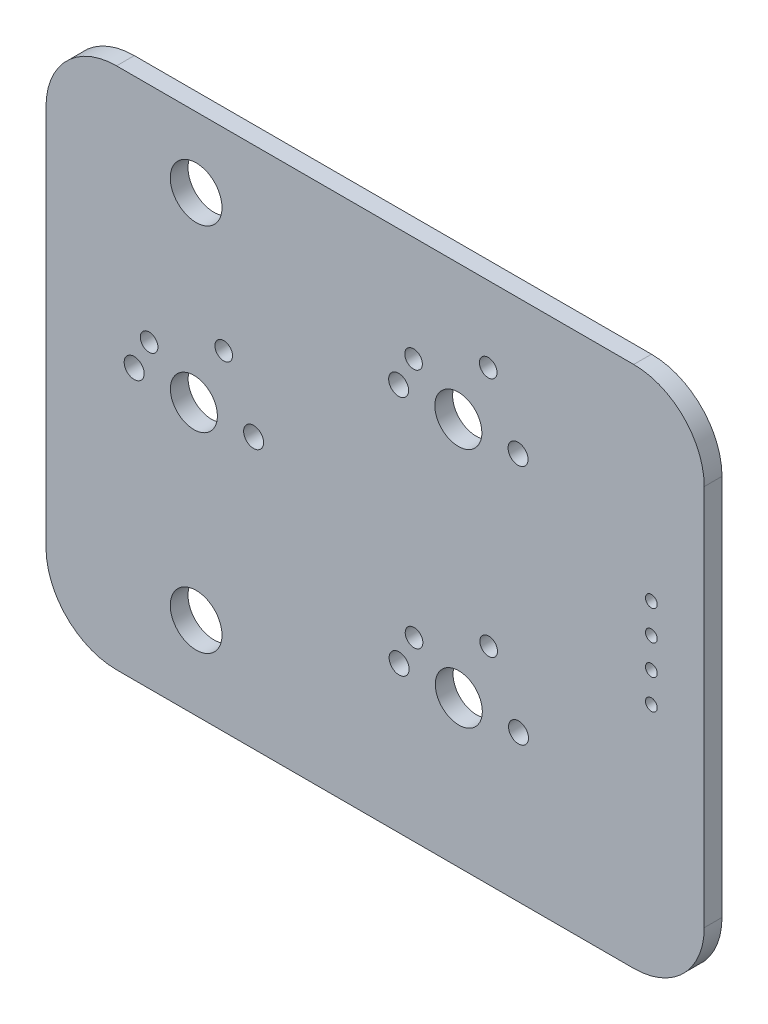
ISO-10303-21;
HEADER;
FILE_DESCRIPTION(('STEP AP214'),'2;1');
FILE_NAME('part.step','',(''),(''),'','','');
FILE_SCHEMA(('AUTOMOTIVE_DESIGN { 1 0 10303 214 1 1 1 1 }'));
ENDSEC;
DATA;
#1=APPLICATION_CONTEXT('core data for automotive mechanical design processes');
#2=APPLICATION_PROTOCOL_DEFINITION('international standard','automotive_design',2000,#1);
#3=PRODUCT_CONTEXT('',#1,'mechanical');
#4=PRODUCT('Part','Part','',(#3));
#5=PRODUCT_RELATED_PRODUCT_CATEGORY('part','',(#4));
#6=PRODUCT_DEFINITION_FORMATION('','',#4);
#7=PRODUCT_DEFINITION_CONTEXT('part definition',#1,'design');
#8=PRODUCT_DEFINITION('design','',#6,#7);
#9=PRODUCT_DEFINITION_SHAPE('','',#8);
#10=(LENGTH_UNIT() NAMED_UNIT(*) SI_UNIT(.MILLI.,.METRE.));
#11=(NAMED_UNIT(*) PLANE_ANGLE_UNIT() SI_UNIT($,.RADIAN.));
#12=(NAMED_UNIT(*) SI_UNIT($,.STERADIAN.) SOLID_ANGLE_UNIT());
#13=UNCERTAINTY_MEASURE_WITH_UNIT(LENGTH_MEASURE(1.E-05),#10,'distance_accuracy_value','');
#14=(GEOMETRIC_REPRESENTATION_CONTEXT(3) GLOBAL_UNCERTAINTY_ASSIGNED_CONTEXT((#13)) GLOBAL_UNIT_ASSIGNED_CONTEXT((#10,
#11,#12)) REPRESENTATION_CONTEXT('',''));
#15=CARTESIAN_POINT('',(0.,0.,0.));
#16=DIRECTION('',(0.,0.,1.));
#17=DIRECTION('',(1.,0.,0.));
#18=AXIS2_PLACEMENT_3D('',#15,#16,#17);
#19=CARTESIAN_POINT('',(76.35,-76.46,-0.046));
#20=DIRECTION('',(0.,0.,-1.));
#21=DIRECTION('',(0.,-1.,0.));
#22=AXIS2_PLACEMENT_3D('',#19,#20,#21);
#23=CYLINDRICAL_SURFACE('',#22,0.75);
#24=CARTESIAN_POINT('',(76.35,-76.46,0.));
#25=DIRECTION('',(0.,0.,-1.));
#26=DIRECTION('',(0.,-1.,0.));
#27=AXIS2_PLACEMENT_3D('',#24,#25,#26);
#28=CIRCLE('',#27,0.75);
#29=CARTESIAN_POINT('',(76.35,-77.21,0.));
#30=VERTEX_POINT('',#29);
#31=EDGE_CURVE('E474',#30,#30,#28,.T.);
#32=ORIENTED_EDGE('',*,*,#31,.T.);
#33=DIRECTION('',(0.,0.,1.));
#34=VECTOR('',#33,1.);
#35=CARTESIAN_POINT('',(76.35,-77.21,-0.046));
#36=LINE('',#35,#34);
#37=CARTESIAN_POINT('',(76.35,-77.21,1.51));
#38=VERTEX_POINT('',#37);
#39=EDGE_CURVE('E11',#30,#38,#36,.T.);
#40=ORIENTED_EDGE('',*,*,#39,.T.);
#41=CARTESIAN_POINT('',(76.35,-76.46,1.51));
#42=DIRECTION('',(0.,0.,-1.));
#43=DIRECTION('',(0.,-1.,0.));
#44=AXIS2_PLACEMENT_3D('',#41,#42,#43);
#45=CIRCLE('',#44,0.75);
#46=EDGE_CURVE('E547',#38,#38,#45,.T.);
#47=ORIENTED_EDGE('',*,*,#46,.F.);
#48=ORIENTED_EDGE('',*,*,#39,.F.);
#49=EDGE_LOOP('',(#32,#40,#47,#48));
#50=FACE_BOUND('',#49,.T.);
#51=ADVANCED_FACE('F17',(#50),#23,.F.);
#52=CARTESIAN_POINT('',(78.89,-81.54,-0.046));
#53=DIRECTION('',(0.,0.,-1.));
#54=DIRECTION('',(0.,-1.,0.));
#55=AXIS2_PLACEMENT_3D('',#52,#53,#54);
#56=CYLINDRICAL_SURFACE('',#55,0.85);
#57=CARTESIAN_POINT('',(78.89,-81.54,0.));
#58=DIRECTION('',(0.,0.,-1.));
#59=DIRECTION('',(0.,-1.,0.));
#60=AXIS2_PLACEMENT_3D('',#57,#58,#59);
#61=CIRCLE('',#60,0.85);
#62=CARTESIAN_POINT('',(78.89,-82.39,0.));
#63=VERTEX_POINT('',#62);
#64=EDGE_CURVE('E427',#63,#63,#61,.T.);
#65=ORIENTED_EDGE('',*,*,#64,.T.);
#66=DIRECTION('',(0.,0.,1.));
#67=VECTOR('',#66,1.);
#68=CARTESIAN_POINT('',(78.89,-82.39,-0.046));
#69=LINE('',#68,#67);
#70=CARTESIAN_POINT('',(78.89,-82.39,1.51));
#71=VERTEX_POINT('',#70);
#72=EDGE_CURVE('E25',#63,#71,#69,.T.);
#73=ORIENTED_EDGE('',*,*,#72,.T.);
#74=CARTESIAN_POINT('',(78.89,-81.54,1.51));
#75=DIRECTION('',(0.,0.,-1.));
#76=DIRECTION('',(0.,-1.,0.));
#77=AXIS2_PLACEMENT_3D('',#74,#75,#76);
#78=CIRCLE('',#77,0.85);
#79=EDGE_CURVE('E482',#71,#71,#78,.T.);
#80=ORIENTED_EDGE('',*,*,#79,.F.);
#81=ORIENTED_EDGE('',*,*,#72,.F.);
#82=EDGE_LOOP('',(#65,#73,#80,#81));
#83=FACE_BOUND('',#82,.T.);
#84=ADVANCED_FACE('F665',(#83),#56,.F.);
#85=CARTESIAN_POINT('',(73.81,-81.54,-0.046));
#86=DIRECTION('',(0.,0.,-1.));
#87=DIRECTION('',(0.,-1.,0.));
#88=AXIS2_PLACEMENT_3D('',#85,#86,#87);
#89=CYLINDRICAL_SURFACE('',#88,2.);
#90=CARTESIAN_POINT('',(73.81,-81.54,0.));
#91=DIRECTION('',(0.,0.,-1.));
#92=DIRECTION('',(0.,-1.,0.));
#93=AXIS2_PLACEMENT_3D('',#90,#91,#92);
#94=CIRCLE('',#93,2.);
#95=CARTESIAN_POINT('',(73.81,-83.54,0.));
#96=VERTEX_POINT('',#95);
#97=EDGE_CURVE('E348',#96,#96,#94,.T.);
#98=ORIENTED_EDGE('',*,*,#97,.T.);
#99=DIRECTION('',(0.,0.,1.));
#100=VECTOR('',#99,1.);
#101=CARTESIAN_POINT('',(73.81,-83.54,-0.046));
#102=LINE('',#101,#100);
#103=CARTESIAN_POINT('',(73.81,-83.54,1.51));
#104=VERTEX_POINT('',#103);
#105=EDGE_CURVE('E555',#96,#104,#102,.T.);
#106=ORIENTED_EDGE('',*,*,#105,.T.);
#107=CARTESIAN_POINT('',(73.81,-81.54,1.51));
#108=DIRECTION('',(0.,0.,-1.));
#109=DIRECTION('',(0.,-1.,0.));
#110=AXIS2_PLACEMENT_3D('',#107,#108,#109);
#111=CIRCLE('',#110,2.);
#112=EDGE_CURVE('E478',#104,#104,#111,.T.);
#113=ORIENTED_EDGE('',*,*,#112,.F.);
#114=ORIENTED_EDGE('',*,*,#105,.F.);
#115=EDGE_LOOP('',(#98,#106,#113,#114));
#116=FACE_BOUND('',#115,.T.);
#117=ADVANCED_FACE('F669',(#116),#89,.F.);
#118=CARTESIAN_POINT('',(70.,-79.,-0.046));
#119=DIRECTION('',(0.,0.,-1.));
#120=DIRECTION('',(0.,-1.,0.));
#121=AXIS2_PLACEMENT_3D('',#118,#119,#120);
#122=CYLINDRICAL_SURFACE('',#121,0.75);
#123=CARTESIAN_POINT('',(70.,-79.,0.));
#124=DIRECTION('',(0.,0.,-1.));
#125=DIRECTION('',(0.,-1.,0.));
#126=AXIS2_PLACEMENT_3D('',#123,#124,#125);
#127=CIRCLE('',#126,0.75);
#128=CARTESIAN_POINT('',(70.,-79.75,0.));
#129=VERTEX_POINT('',#128);
#130=EDGE_CURVE('E344',#129,#129,#127,.T.);
#131=ORIENTED_EDGE('',*,*,#130,.T.);
#132=DIRECTION('',(0.,0.,1.));
#133=VECTOR('',#132,1.);
#134=CARTESIAN_POINT('',(70.,-79.75,-0.046));
#135=LINE('',#134,#133);
#136=CARTESIAN_POINT('',(70.,-79.75,1.51));
#137=VERTEX_POINT('',#136);
#138=EDGE_CURVE('E342',#129,#137,#135,.T.);
#139=ORIENTED_EDGE('',*,*,#138,.T.);
#140=CARTESIAN_POINT('',(70.,-79.,1.51));
#141=DIRECTION('',(0.,0.,-1.));
#142=DIRECTION('',(0.,-1.,0.));
#143=AXIS2_PLACEMENT_3D('',#140,#141,#142);
#144=CIRCLE('',#143,0.75);
#145=EDGE_CURVE('E439',#137,#137,#144,.T.);
#146=ORIENTED_EDGE('',*,*,#145,.F.);
#147=ORIENTED_EDGE('',*,*,#138,.F.);
#148=EDGE_LOOP('',(#131,#139,#146,#147));
#149=FACE_BOUND('',#148,.T.);
#150=ADVANCED_FACE('F593',(#149),#122,.F.);
#151=CARTESIAN_POINT('',(68.73,-81.54,-0.046));
#152=DIRECTION('',(0.,0.,-1.));
#153=DIRECTION('',(0.,-1.,0.));
#154=AXIS2_PLACEMENT_3D('',#151,#152,#153);
#155=CYLINDRICAL_SURFACE('',#154,0.85);
#156=CARTESIAN_POINT('',(68.73,-81.54,0.));
#157=DIRECTION('',(0.,0.,-1.));
#158=DIRECTION('',(0.,-1.,0.));
#159=AXIS2_PLACEMENT_3D('',#156,#157,#158);
#160=CIRCLE('',#159,0.85);
#161=CARTESIAN_POINT('',(68.73,-82.39,0.));
#162=VERTEX_POINT('',#161);
#163=EDGE_CURVE('E349',#162,#162,#160,.T.);
#164=ORIENTED_EDGE('',*,*,#163,.T.);
#165=DIRECTION('',(0.,0.,1.));
#166=VECTOR('',#165,1.);
#167=CARTESIAN_POINT('',(68.73,-82.39,-0.046));
#168=LINE('',#167,#166);
#169=CARTESIAN_POINT('',(68.73,-82.39,1.51));
#170=VERTEX_POINT('',#169);
#171=EDGE_CURVE('E339',#162,#170,#168,.T.);
#172=ORIENTED_EDGE('',*,*,#171,.T.);
#173=CARTESIAN_POINT('',(68.73,-81.54,1.51));
#174=DIRECTION('',(0.,0.,-1.));
#175=DIRECTION('',(0.,-1.,0.));
#176=AXIS2_PLACEMENT_3D('',#173,#174,#175);
#177=CIRCLE('',#176,0.85);
#178=EDGE_CURVE('E435',#170,#170,#177,.T.);
#179=ORIENTED_EDGE('',*,*,#178,.F.);
#180=ORIENTED_EDGE('',*,*,#171,.F.);
#181=EDGE_LOOP('',(#164,#172,#179,#180));
#182=FACE_BOUND('',#181,.T.);
#183=ADVANCED_FACE('F777',(#182),#155,.F.);
#184=CARTESIAN_POINT('',(90.23,-86.73,-0.046));
#185=DIRECTION('',(0.,0.,-1.));
#186=DIRECTION('',(0.,-1.,0.));
#187=AXIS2_PLACEMENT_3D('',#184,#185,#186);
#188=CYLINDRICAL_SURFACE('',#187,0.5);
#189=CARTESIAN_POINT('',(90.23,-86.73,0.));
#190=DIRECTION('',(0.,0.,-1.));
#191=DIRECTION('',(0.,-1.,0.));
#192=AXIS2_PLACEMENT_3D('',#189,#190,#191);
#193=CIRCLE('',#192,0.5);
#194=CARTESIAN_POINT('',(90.23,-87.23,0.));
#195=VERTEX_POINT('',#194);
#196=EDGE_CURVE('E385',#195,#195,#193,.T.);
#197=ORIENTED_EDGE('',*,*,#196,.T.);
#198=DIRECTION('',(0.,0.,1.));
#199=VECTOR('',#198,1.);
#200=CARTESIAN_POINT('',(90.23,-87.23,-0.046));
#201=LINE('',#200,#199);
#202=CARTESIAN_POINT('',(90.23,-87.23,1.51));
#203=VERTEX_POINT('',#202);
#204=EDGE_CURVE('E343',#195,#203,#201,.T.);
#205=ORIENTED_EDGE('',*,*,#204,.T.);
#206=CARTESIAN_POINT('',(90.23,-86.73,1.51));
#207=DIRECTION('',(0.,0.,-1.));
#208=DIRECTION('',(0.,-1.,0.));
#209=AXIS2_PLACEMENT_3D('',#206,#207,#208);
#210=CIRCLE('',#209,0.5);
#211=EDGE_CURVE('E440',#203,#203,#210,.T.);
#212=ORIENTED_EDGE('',*,*,#211,.F.);
#213=ORIENTED_EDGE('',*,*,#204,.F.);
#214=EDGE_LOOP('',(#197,#205,#212,#213));
#215=FACE_BOUND('',#214,.T.);
#216=ADVANCED_FACE('F773',(#215),#188,.F.);
#217=CARTESIAN_POINT('',(90.23,-89.27,-0.046));
#218=DIRECTION('',(0.,0.,-1.));
#219=DIRECTION('',(0.,-1.,0.));
#220=AXIS2_PLACEMENT_3D('',#217,#218,#219);
#221=CYLINDRICAL_SURFACE('',#220,0.5);
#222=CARTESIAN_POINT('',(90.23,-89.27,0.));
#223=DIRECTION('',(0.,0.,-1.));
#224=DIRECTION('',(0.,-1.,0.));
#225=AXIS2_PLACEMENT_3D('',#222,#223,#224);
#226=CIRCLE('',#225,0.5);
#227=CARTESIAN_POINT('',(90.23,-89.77,0.));
#228=VERTEX_POINT('',#227);
#229=EDGE_CURVE('E389',#228,#228,#226,.T.);
#230=ORIENTED_EDGE('',*,*,#229,.T.);
#231=DIRECTION('',(0.,0.,1.));
#232=VECTOR('',#231,1.);
#233=CARTESIAN_POINT('',(90.23,-89.77,-0.046));
#234=LINE('',#233,#232);
#235=CARTESIAN_POINT('',(90.23,-89.77,1.51));
#236=VERTEX_POINT('',#235);
#237=EDGE_CURVE('E455',#228,#236,#234,.T.);
#238=ORIENTED_EDGE('',*,*,#237,.T.);
#239=CARTESIAN_POINT('',(90.23,-89.27,1.51));
#240=DIRECTION('',(0.,0.,-1.));
#241=DIRECTION('',(0.,-1.,0.));
#242=AXIS2_PLACEMENT_3D('',#239,#240,#241);
#243=CIRCLE('',#242,0.5);
#244=EDGE_CURVE('E538',#236,#236,#243,.T.);
#245=ORIENTED_EDGE('',*,*,#244,.F.);
#246=ORIENTED_EDGE('',*,*,#237,.F.);
#247=EDGE_LOOP('',(#230,#238,#245,#246));
#248=FACE_BOUND('',#247,.T.);
#249=ADVANCED_FACE('F769',(#248),#221,.F.);
#250=CARTESIAN_POINT('',(51.5,-76.,0.));
#251=DIRECTION('',(0.,0.,-1.));
#252=DIRECTION('',(1.,0.,0.));
#253=AXIS2_PLACEMENT_3D('',#250,#251,#252);
#254=CYLINDRICAL_SURFACE('',#253,2.2);
#255=DIRECTION('',(0.,0.,1.));
#256=VECTOR('',#255,1.);
#257=CARTESIAN_POINT('',(53.7,-76.,0.));
#258=LINE('',#257,#256);
#259=CARTESIAN_POINT('',(53.7,-76.,0.));
#260=VERTEX_POINT('',#259);
#261=CARTESIAN_POINT('',(53.7,-76.,1.51));
#262=VERTEX_POINT('',#261);
#263=EDGE_CURVE('E458',#260,#262,#258,.T.);
#264=ORIENTED_EDGE('',*,*,#263,.T.);
#265=CARTESIAN_POINT('',(51.5,-76.,1.51));
#266=DIRECTION('',(0.,0.,1.));
#267=DIRECTION('',(1.,0.,0.));
#268=AXIS2_PLACEMENT_3D('',#265,#266,#267);
#269=CIRCLE('',#268,2.2);
#270=EDGE_CURVE('E534',#262,#262,#269,.T.);
#271=ORIENTED_EDGE('',*,*,#270,.T.);
#272=ORIENTED_EDGE('',*,*,#263,.F.);
#273=CARTESIAN_POINT('',(51.5,-76.,0.));
#274=DIRECTION('',(0.,0.,1.));
#275=DIRECTION('',(1.,0.,0.));
#276=AXIS2_PLACEMENT_3D('',#273,#274,#275);
#277=CIRCLE('',#276,2.2);
#278=EDGE_CURVE('E448',#260,#260,#277,.T.);
#279=ORIENTED_EDGE('',*,*,#278,.F.);
#280=EDGE_LOOP('',(#264,#271,#272,#279));
#281=FACE_BOUND('',#280,.T.);
#282=ADVANCED_FACE('F765',(#281),#254,.F.);
#283=CARTESIAN_POINT('',(53.85,-86.47,-0.046));
#284=DIRECTION('',(0.,0.,-1.));
#285=DIRECTION('',(0.,-1.,0.));
#286=AXIS2_PLACEMENT_3D('',#283,#284,#285);
#287=CYLINDRICAL_SURFACE('',#286,0.75);
#288=CARTESIAN_POINT('',(53.85,-86.47,0.));
#289=DIRECTION('',(0.,0.,-1.));
#290=DIRECTION('',(0.,-1.,0.));
#291=AXIS2_PLACEMENT_3D('',#288,#289,#290);
#292=CIRCLE('',#291,0.75);
#293=CARTESIAN_POINT('',(53.85,-87.22,0.));
#294=VERTEX_POINT('',#293);
#295=EDGE_CURVE('E447',#294,#294,#292,.T.);
#296=ORIENTED_EDGE('',*,*,#295,.T.);
#297=DIRECTION('',(0.,0.,1.));
#298=VECTOR('',#297,1.);
#299=CARTESIAN_POINT('',(53.85,-87.22,-0.046));
#300=LINE('',#299,#298);
#301=CARTESIAN_POINT('',(53.85,-87.22,1.51));
#302=VERTEX_POINT('',#301);
#303=EDGE_CURVE('E356',#294,#302,#300,.T.);
#304=ORIENTED_EDGE('',*,*,#303,.T.);
#305=CARTESIAN_POINT('',(53.85,-86.47,1.51));
#306=DIRECTION('',(0.,0.,-1.));
#307=DIRECTION('',(0.,-1.,0.));
#308=AXIS2_PLACEMENT_3D('',#305,#306,#307);
#309=CIRCLE('',#308,0.75);
#310=EDGE_CURVE('E530',#302,#302,#309,.T.);
#311=ORIENTED_EDGE('',*,*,#310,.F.);
#312=ORIENTED_EDGE('',*,*,#303,.F.);
#313=EDGE_LOOP('',(#296,#304,#311,#312));
#314=FACE_BOUND('',#313,.T.);
#315=ADVANCED_FACE('F761',(#314),#287,.F.);
#316=CARTESIAN_POINT('',(56.39,-91.55,-0.046));
#317=DIRECTION('',(0.,0.,-1.));
#318=DIRECTION('',(0.,-1.,0.));
#319=AXIS2_PLACEMENT_3D('',#316,#317,#318);
#320=CYLINDRICAL_SURFACE('',#319,0.85);
#321=CARTESIAN_POINT('',(56.39,-91.55,0.));
#322=DIRECTION('',(0.,0.,-1.));
#323=DIRECTION('',(0.,-1.,0.));
#324=AXIS2_PLACEMENT_3D('',#321,#322,#323);
#325=CIRCLE('',#324,0.85);
#326=CARTESIAN_POINT('',(56.39,-92.4,0.));
#327=VERTEX_POINT('',#326);
#328=EDGE_CURVE('E407',#327,#327,#325,.T.);
#329=ORIENTED_EDGE('',*,*,#328,.T.);
#330=DIRECTION('',(0.,0.,1.));
#331=VECTOR('',#330,1.);
#332=CARTESIAN_POINT('',(56.39,-92.4,-0.046));
#333=LINE('',#332,#331);
#334=CARTESIAN_POINT('',(56.39,-92.4,1.51));
#335=VERTEX_POINT('',#334);
#336=EDGE_CURVE('E353',#327,#335,#333,.T.);
#337=ORIENTED_EDGE('',*,*,#336,.T.);
#338=CARTESIAN_POINT('',(56.39,-91.55,1.51));
#339=DIRECTION('',(0.,0.,-1.));
#340=DIRECTION('',(0.,-1.,0.));
#341=AXIS2_PLACEMENT_3D('',#338,#339,#340);
#342=CIRCLE('',#341,0.85);
#343=EDGE_CURVE('E465',#335,#335,#342,.T.);
#344=ORIENTED_EDGE('',*,*,#343,.F.);
#345=ORIENTED_EDGE('',*,*,#336,.F.);
#346=EDGE_LOOP('',(#329,#337,#344,#345));
#347=FACE_BOUND('',#346,.T.);
#348=ADVANCED_FACE('F757',(#347),#320,.F.);
#349=CARTESIAN_POINT('',(51.31,-91.55,-0.046));
#350=DIRECTION('',(0.,0.,-1.));
#351=DIRECTION('',(0.,-1.,0.));
#352=AXIS2_PLACEMENT_3D('',#349,#350,#351);
#353=CYLINDRICAL_SURFACE('',#352,2.);
#354=CARTESIAN_POINT('',(51.31,-91.55,0.));
#355=DIRECTION('',(0.,0.,-1.));
#356=DIRECTION('',(0.,-1.,0.));
#357=AXIS2_PLACEMENT_3D('',#354,#355,#356);
#358=CIRCLE('',#357,2.);
#359=CARTESIAN_POINT('',(51.31,-93.55,0.));
#360=VERTEX_POINT('',#359);
#361=EDGE_CURVE('E403',#360,#360,#358,.T.);
#362=ORIENTED_EDGE('',*,*,#361,.T.);
#363=DIRECTION('',(0.,0.,1.));
#364=VECTOR('',#363,1.);
#365=CARTESIAN_POINT('',(51.31,-93.55,-0.046));
#366=LINE('',#365,#364);
#367=CARTESIAN_POINT('',(51.31,-93.55,1.51));
#368=VERTEX_POINT('',#367);
#369=EDGE_CURVE('E357',#360,#368,#366,.T.);
#370=ORIENTED_EDGE('',*,*,#369,.T.);
#371=CARTESIAN_POINT('',(51.31,-91.55,1.51));
#372=DIRECTION('',(0.,0.,-1.));
#373=DIRECTION('',(0.,-1.,0.));
#374=AXIS2_PLACEMENT_3D('',#371,#372,#373);
#375=CIRCLE('',#374,2.);
#376=EDGE_CURVE('E364',#368,#368,#375,.T.);
#377=ORIENTED_EDGE('',*,*,#376,.F.);
#378=ORIENTED_EDGE('',*,*,#369,.F.);
#379=EDGE_LOOP('',(#362,#370,#377,#378));
#380=FACE_BOUND('',#379,.T.);
#381=ADVANCED_FACE('F753',(#380),#353,.F.);
#382=CARTESIAN_POINT('',(47.5,-89.01,-0.046));
#383=DIRECTION('',(0.,0.,-1.));
#384=DIRECTION('',(0.,-1.,0.));
#385=AXIS2_PLACEMENT_3D('',#382,#383,#384);
#386=CYLINDRICAL_SURFACE('',#385,0.75);
#387=CARTESIAN_POINT('',(47.5,-89.01,0.));
#388=DIRECTION('',(0.,0.,-1.));
#389=DIRECTION('',(0.,-1.,0.));
#390=AXIS2_PLACEMENT_3D('',#387,#388,#389);
#391=CIRCLE('',#390,0.75);
#392=CARTESIAN_POINT('',(47.5,-89.76,0.));
#393=VERTEX_POINT('',#392);
#394=EDGE_CURVE('E408',#393,#393,#391,.T.);
#395=ORIENTED_EDGE('',*,*,#394,.T.);
#396=DIRECTION('',(0.,0.,1.));
#397=VECTOR('',#396,1.);
#398=CARTESIAN_POINT('',(47.5,-89.76,-0.046));
#399=LINE('',#398,#397);
#400=CARTESIAN_POINT('',(47.5,-89.76,1.51));
#401=VERTEX_POINT('',#400);
#402=EDGE_CURVE('E578',#393,#401,#399,.T.);
#403=ORIENTED_EDGE('',*,*,#402,.T.);
#404=CARTESIAN_POINT('',(47.5,-89.01,1.51));
#405=DIRECTION('',(0.,0.,-1.));
#406=DIRECTION('',(0.,-1.,0.));
#407=AXIS2_PLACEMENT_3D('',#404,#405,#406);
#408=CIRCLE('',#407,0.75);
#409=EDGE_CURVE('E360',#401,#401,#408,.T.);
#410=ORIENTED_EDGE('',*,*,#409,.F.);
#411=ORIENTED_EDGE('',*,*,#402,.F.);
#412=EDGE_LOOP('',(#395,#403,#410,#411));
#413=FACE_BOUND('',#412,.T.);
#414=ADVANCED_FACE('F749',(#413),#386,.F.);
#415=CARTESIAN_POINT('',(46.23,-91.55,-0.046));
#416=DIRECTION('',(0.,0.,-1.));
#417=DIRECTION('',(0.,-1.,0.));
#418=AXIS2_PLACEMENT_3D('',#415,#416,#417);
#419=CYLINDRICAL_SURFACE('',#418,0.85);
#420=CARTESIAN_POINT('',(46.23,-91.55,0.));
#421=DIRECTION('',(0.,0.,-1.));
#422=DIRECTION('',(0.,-1.,0.));
#423=AXIS2_PLACEMENT_3D('',#420,#421,#422);
#424=CIRCLE('',#423,0.85);
#425=CARTESIAN_POINT('',(46.23,-92.4,0.));
#426=VERTEX_POINT('',#425);
#427=EDGE_CURVE('E431',#426,#426,#424,.T.);
#428=ORIENTED_EDGE('',*,*,#427,.T.);
#429=DIRECTION('',(0.,0.,1.));
#430=VECTOR('',#429,1.);
#431=CARTESIAN_POINT('',(46.23,-92.4,-0.046));
#432=LINE('',#431,#430);
#433=CARTESIAN_POINT('',(46.23,-92.4,1.51));
#434=VERTEX_POINT('',#433);
#435=EDGE_CURVE('E573',#426,#434,#432,.T.);
#436=ORIENTED_EDGE('',*,*,#435,.T.);
#437=CARTESIAN_POINT('',(46.23,-91.55,1.51));
#438=DIRECTION('',(0.,0.,-1.));
#439=DIRECTION('',(0.,-1.,0.));
#440=AXIS2_PLACEMENT_3D('',#437,#438,#439);
#441=CIRCLE('',#440,0.85);
#442=EDGE_CURVE('E365',#434,#434,#441,.T.);
#443=ORIENTED_EDGE('',*,*,#442,.F.);
#444=ORIENTED_EDGE('',*,*,#435,.F.);
#445=EDGE_LOOP('',(#428,#436,#443,#444));
#446=FACE_BOUND('',#445,.T.);
#447=ADVANCED_FACE('F745',(#446),#419,.F.);
#448=CARTESIAN_POINT('',(90.23,-91.81,-0.046));
#449=DIRECTION('',(0.,0.,-1.));
#450=DIRECTION('',(0.,-1.,0.));
#451=AXIS2_PLACEMENT_3D('',#448,#449,#450);
#452=CYLINDRICAL_SURFACE('',#451,0.5);
#453=CARTESIAN_POINT('',(90.23,-91.81,0.));
#454=DIRECTION('',(0.,0.,-1.));
#455=DIRECTION('',(0.,-1.,0.));
#456=AXIS2_PLACEMENT_3D('',#453,#454,#455);
#457=CIRCLE('',#456,0.5);
#458=CARTESIAN_POINT('',(90.23,-92.31,0.));
#459=VERTEX_POINT('',#458);
#460=EDGE_CURVE('E423',#459,#459,#457,.T.);
#461=ORIENTED_EDGE('',*,*,#460,.T.);
#462=DIRECTION('',(0.,0.,1.));
#463=VECTOR('',#462,1.);
#464=CARTESIAN_POINT('',(90.23,-92.31,-0.046));
#465=LINE('',#464,#463);
#466=CARTESIAN_POINT('',(90.23,-92.31,1.51));
#467=VERTEX_POINT('',#466);
#468=EDGE_CURVE('E397',#459,#467,#465,.T.);
#469=ORIENTED_EDGE('',*,*,#468,.T.);
#470=CARTESIAN_POINT('',(90.23,-91.81,1.51));
#471=DIRECTION('',(0.,0.,-1.));
#472=DIRECTION('',(0.,-1.,0.));
#473=AXIS2_PLACEMENT_3D('',#470,#471,#472);
#474=CIRCLE('',#473,0.5);
#475=EDGE_CURVE('E418',#467,#467,#474,.T.);
#476=ORIENTED_EDGE('',*,*,#475,.F.);
#477=ORIENTED_EDGE('',*,*,#468,.F.);
#478=EDGE_LOOP('',(#461,#469,#476,#477));
#479=FACE_BOUND('',#478,.T.);
#480=ADVANCED_FACE('F742',(#479),#452,.F.);
#481=CARTESIAN_POINT('',(90.23,-94.35,-0.046));
#482=DIRECTION('',(0.,0.,-1.));
#483=DIRECTION('',(0.,-1.,0.));
#484=AXIS2_PLACEMENT_3D('',#481,#482,#483);
#485=CYLINDRICAL_SURFACE('',#484,0.5);
#486=CARTESIAN_POINT('',(90.23,-94.35,0.));
#487=DIRECTION('',(0.,0.,-1.));
#488=DIRECTION('',(0.,-1.,0.));
#489=AXIS2_PLACEMENT_3D('',#486,#487,#488);
#490=CIRCLE('',#489,0.5);
#491=CARTESIAN_POINT('',(90.23,-94.85,0.));
#492=VERTEX_POINT('',#491);
#493=EDGE_CURVE('E413',#492,#492,#490,.T.);
#494=ORIENTED_EDGE('',*,*,#493,.T.);
#495=DIRECTION('',(0.,0.,1.));
#496=VECTOR('',#495,1.);
#497=CARTESIAN_POINT('',(90.23,-94.85,-0.046));
#498=LINE('',#497,#496);
#499=CARTESIAN_POINT('',(90.23,-94.85,1.51));
#500=VERTEX_POINT('',#499);
#501=EDGE_CURVE('E394',#492,#500,#498,.T.);
#502=ORIENTED_EDGE('',*,*,#501,.T.);
#503=CARTESIAN_POINT('',(90.23,-94.35,1.51));
#504=DIRECTION('',(0.,0.,-1.));
#505=DIRECTION('',(0.,-1.,0.));
#506=AXIS2_PLACEMENT_3D('',#503,#504,#505);
#507=CIRCLE('',#506,0.5);
#508=EDGE_CURVE('E414',#500,#500,#507,.T.);
#509=ORIENTED_EDGE('',*,*,#508,.F.);
#510=ORIENTED_EDGE('',*,*,#501,.F.);
#511=EDGE_LOOP('',(#494,#502,#509,#510));
#512=FACE_BOUND('',#511,.T.);
#513=ADVANCED_FACE('F740',(#512),#485,.F.);
#514=CARTESIAN_POINT('',(76.39,-96.97,-0.046));
#515=DIRECTION('',(0.,0.,-1.));
#516=DIRECTION('',(0.,-1.,0.));
#517=AXIS2_PLACEMENT_3D('',#514,#515,#516);
#518=CYLINDRICAL_SURFACE('',#517,0.75);
#519=CARTESIAN_POINT('',(76.39,-96.97,0.));
#520=DIRECTION('',(0.,0.,-1.));
#521=DIRECTION('',(0.,-1.,0.));
#522=AXIS2_PLACEMENT_3D('',#519,#520,#521);
#523=CIRCLE('',#522,0.75);
#524=CARTESIAN_POINT('',(76.39,-97.72,0.));
#525=VERTEX_POINT('',#524);
#526=EDGE_CURVE('E409',#525,#525,#523,.T.);
#527=ORIENTED_EDGE('',*,*,#526,.T.);
#528=DIRECTION('',(0.,0.,1.));
#529=VECTOR('',#528,1.);
#530=CARTESIAN_POINT('',(76.39,-97.72,-0.046));
#531=LINE('',#530,#529);
#532=CARTESIAN_POINT('',(76.39,-97.72,1.51));
#533=VERTEX_POINT('',#532);
#534=EDGE_CURVE('E398',#525,#533,#531,.T.);
#535=ORIENTED_EDGE('',*,*,#534,.T.);
#536=CARTESIAN_POINT('',(76.39,-96.97,1.51));
#537=DIRECTION('',(0.,0.,-1.));
#538=DIRECTION('',(0.,-1.,0.));
#539=AXIS2_PLACEMENT_3D('',#536,#537,#538);
#540=CIRCLE('',#539,0.75);
#541=EDGE_CURVE('E419',#533,#533,#540,.T.);
#542=ORIENTED_EDGE('',*,*,#541,.F.);
#543=ORIENTED_EDGE('',*,*,#534,.F.);
#544=EDGE_LOOP('',(#527,#535,#542,#543));
#545=FACE_BOUND('',#544,.T.);
#546=ADVANCED_FACE('F736',(#545),#518,.F.);
#547=CARTESIAN_POINT('',(70.04,-99.51,-0.046));
#548=DIRECTION('',(0.,0.,-1.));
#549=DIRECTION('',(0.,-1.,0.));
#550=AXIS2_PLACEMENT_3D('',#547,#548,#549);
#551=CYLINDRICAL_SURFACE('',#550,0.75);
#552=CARTESIAN_POINT('',(70.04,-99.51,0.));
#553=DIRECTION('',(0.,0.,-1.));
#554=DIRECTION('',(0.,-1.,0.));
#555=AXIS2_PLACEMENT_3D('',#552,#553,#554);
#556=CIRCLE('',#555,0.75);
#557=CARTESIAN_POINT('',(70.04,-100.26,0.));
#558=VERTEX_POINT('',#557);
#559=EDGE_CURVE('E402',#558,#558,#556,.T.);
#560=ORIENTED_EDGE('',*,*,#559,.T.);
#561=DIRECTION('',(0.,0.,1.));
#562=VECTOR('',#561,1.);
#563=CARTESIAN_POINT('',(70.04,-100.26,-0.046));
#564=LINE('',#563,#562);
#565=CARTESIAN_POINT('',(70.04,-100.26,1.51));
#566=VERTEX_POINT('',#565);
#567=EDGE_CURVE('E566',#558,#566,#564,.T.);
#568=ORIENTED_EDGE('',*,*,#567,.T.);
#569=CARTESIAN_POINT('',(70.04,-99.51,1.51));
#570=DIRECTION('',(0.,0.,-1.));
#571=DIRECTION('',(0.,-1.,0.));
#572=AXIS2_PLACEMENT_3D('',#569,#570,#571);
#573=CIRCLE('',#572,0.75);
#574=EDGE_CURVE('E506',#566,#566,#573,.T.);
#575=ORIENTED_EDGE('',*,*,#574,.F.);
#576=ORIENTED_EDGE('',*,*,#567,.F.);
#577=EDGE_LOOP('',(#560,#568,#575,#576));
#578=FACE_BOUND('',#577,.T.);
#579=ADVANCED_FACE('F733',(#578),#551,.F.);
#580=CARTESIAN_POINT('',(78.93,-102.05,-0.046));
#581=DIRECTION('',(0.,0.,-1.));
#582=DIRECTION('',(0.,-1.,0.));
#583=AXIS2_PLACEMENT_3D('',#580,#581,#582);
#584=CYLINDRICAL_SURFACE('',#583,0.85);
#585=CARTESIAN_POINT('',(78.93,-102.05,0.));
#586=DIRECTION('',(0.,0.,-1.));
#587=DIRECTION('',(0.,-1.,0.));
#588=AXIS2_PLACEMENT_3D('',#585,#586,#587);
#589=CIRCLE('',#588,0.85);
#590=CARTESIAN_POINT('',(78.93,-102.9,0.));
#591=VERTEX_POINT('',#590);
#592=EDGE_CURVE('E393',#591,#591,#589,.T.);
#593=ORIENTED_EDGE('',*,*,#592,.T.);
#594=DIRECTION('',(0.,0.,1.));
#595=VECTOR('',#594,1.);
#596=CARTESIAN_POINT('',(78.93,-102.9,-0.046));
#597=LINE('',#596,#595);
#598=CARTESIAN_POINT('',(78.93,-102.9,1.51));
#599=VERTEX_POINT('',#598);
#600=EDGE_CURVE('E321',#591,#599,#597,.T.);
#601=ORIENTED_EDGE('',*,*,#600,.T.);
#602=CARTESIAN_POINT('',(78.93,-102.05,1.51));
#603=DIRECTION('',(0.,0.,-1.));
#604=DIRECTION('',(0.,-1.,0.));
#605=AXIS2_PLACEMENT_3D('',#602,#603,#604);
#606=CIRCLE('',#605,0.85);
#607=EDGE_CURVE('E502',#599,#599,#606,.T.);
#608=ORIENTED_EDGE('',*,*,#607,.F.);
#609=ORIENTED_EDGE('',*,*,#600,.F.);
#610=EDGE_LOOP('',(#593,#601,#608,#609));
#611=FACE_BOUND('',#610,.T.);
#612=ADVANCED_FACE('F731',(#611),#584,.F.);
#613=CARTESIAN_POINT('',(73.85,-102.05,-0.046));
#614=DIRECTION('',(0.,0.,-1.));
#615=DIRECTION('',(0.,-1.,0.));
#616=AXIS2_PLACEMENT_3D('',#613,#614,#615);
#617=CYLINDRICAL_SURFACE('',#616,2.);
#618=CARTESIAN_POINT('',(73.85,-102.05,0.));
#619=DIRECTION('',(0.,0.,-1.));
#620=DIRECTION('',(0.,-1.,0.));
#621=AXIS2_PLACEMENT_3D('',#618,#619,#620);
#622=CIRCLE('',#621,2.);
#623=CARTESIAN_POINT('',(73.85,-104.05,0.));
#624=VERTEX_POINT('',#623);
#625=EDGE_CURVE('E379',#624,#624,#622,.T.);
#626=ORIENTED_EDGE('',*,*,#625,.T.);
#627=DIRECTION('',(0.,0.,1.));
#628=VECTOR('',#627,1.);
#629=CARTESIAN_POINT('',(73.85,-104.05,-0.046));
#630=LINE('',#629,#628);
#631=CARTESIAN_POINT('',(73.85,-104.05,1.51));
#632=VERTEX_POINT('',#631);
#633=EDGE_CURVE('E318',#624,#632,#630,.T.);
#634=ORIENTED_EDGE('',*,*,#633,.T.);
#635=CARTESIAN_POINT('',(73.85,-102.05,1.51));
#636=DIRECTION('',(0.,0.,-1.));
#637=DIRECTION('',(0.,-1.,0.));
#638=AXIS2_PLACEMENT_3D('',#635,#636,#637);
#639=CIRCLE('',#638,2.);
#640=EDGE_CURVE('E507',#632,#632,#639,.T.);
#641=ORIENTED_EDGE('',*,*,#640,.F.);
#642=ORIENTED_EDGE('',*,*,#633,.F.);
#643=EDGE_LOOP('',(#626,#634,#641,#642));
#644=FACE_BOUND('',#643,.T.);
#645=ADVANCED_FACE('F724',(#644),#617,.F.);
#646=CARTESIAN_POINT('',(68.77,-102.05,-0.046));
#647=DIRECTION('',(0.,0.,-1.));
#648=DIRECTION('',(0.,-1.,0.));
#649=AXIS2_PLACEMENT_3D('',#646,#647,#648);
#650=CYLINDRICAL_SURFACE('',#649,0.85);
#651=CARTESIAN_POINT('',(68.77,-102.05,0.));
#652=DIRECTION('',(0.,0.,-1.));
#653=DIRECTION('',(0.,-1.,0.));
#654=AXIS2_PLACEMENT_3D('',#651,#652,#653);
#655=CIRCLE('',#654,0.85);
#656=CARTESIAN_POINT('',(68.77,-102.9,0.));
#657=VERTEX_POINT('',#656);
#658=EDGE_CURVE('E375',#657,#657,#655,.T.);
#659=ORIENTED_EDGE('',*,*,#658,.T.);
#660=DIRECTION('',(0.,0.,1.));
#661=VECTOR('',#660,1.);
#662=CARTESIAN_POINT('',(68.77,-102.9,-0.046));
#663=LINE('',#662,#661);
#664=CARTESIAN_POINT('',(68.77,-102.9,1.51));
#665=VERTEX_POINT('',#664);
#666=EDGE_CURVE('E311',#657,#665,#663,.T.);
#667=ORIENTED_EDGE('',*,*,#666,.T.);
#668=CARTESIAN_POINT('',(68.77,-102.05,1.51));
#669=DIRECTION('',(0.,0.,-1.));
#670=DIRECTION('',(0.,-1.,0.));
#671=AXIS2_PLACEMENT_3D('',#668,#669,#670);
#672=CIRCLE('',#671,0.85);
#673=EDGE_CURVE('E511',#665,#665,#672,.T.);
#674=ORIENTED_EDGE('',*,*,#673,.F.);
#675=ORIENTED_EDGE('',*,*,#666,.F.);
#676=EDGE_LOOP('',(#659,#667,#674,#675));
#677=FACE_BOUND('',#676,.T.);
#678=ADVANCED_FACE('F717',(#677),#650,.F.);
#679=CARTESIAN_POINT('',(51.5,-107.5,0.));
#680=DIRECTION('',(0.,0.,-1.));
#681=DIRECTION('',(1.,0.,0.));
#682=AXIS2_PLACEMENT_3D('',#679,#680,#681);
#683=CYLINDRICAL_SURFACE('',#682,2.2);
#684=DIRECTION('',(0.,0.,1.));
#685=VECTOR('',#684,1.);
#686=CARTESIAN_POINT('',(53.7,-107.5,0.));
#687=LINE('',#686,#685);
#688=CARTESIAN_POINT('',(53.7,-107.5,0.));
#689=VERTEX_POINT('',#688);
#690=CARTESIAN_POINT('',(53.7,-107.5,1.51));
#691=VERTEX_POINT('',#690);
#692=EDGE_CURVE('E561',#689,#691,#687,.T.);
#693=ORIENTED_EDGE('',*,*,#692,.T.);
#694=CARTESIAN_POINT('',(51.5,-107.5,1.51));
#695=DIRECTION('',(0.,0.,1.));
#696=DIRECTION('',(1.,0.,0.));
#697=AXIS2_PLACEMENT_3D('',#694,#695,#696);
#698=CIRCLE('',#697,2.2);
#699=EDGE_CURVE('E501',#691,#691,#698,.T.);
#700=ORIENTED_EDGE('',*,*,#699,.T.);
#701=ORIENTED_EDGE('',*,*,#692,.F.);
#702=CARTESIAN_POINT('',(51.5,-107.5,0.));
#703=DIRECTION('',(0.,0.,1.));
#704=DIRECTION('',(1.,0.,0.));
#705=AXIS2_PLACEMENT_3D('',#702,#703,#704);
#706=CIRCLE('',#705,2.2);
#707=EDGE_CURVE('E316',#689,#689,#706,.T.);
#708=ORIENTED_EDGE('',*,*,#707,.F.);
#709=EDGE_LOOP('',(#693,#700,#701,#708));
#710=FACE_BOUND('',#709,.T.);
#711=ADVANCED_FACE('F715',(#710),#683,.F.);
#712=CARTESIAN_POINT('',(44.729998931759,-108.5400010682,0.));
#713=DIRECTION('',(0.,0.,-1.));
#714=DIRECTION('',(1.78040254855297E-07,-0.999999999999984,0.));
#715=AXIS2_PLACEMENT_3D('',#712,#713,#714);
#716=CYLINDRICAL_SURFACE('',#715,5.999998931759);
#717=DIRECTION('',(0.,0.,1.));
#718=VECTOR('',#717,1.);
#719=CARTESIAN_POINT('',(44.73,-114.54,0.));
#720=LINE('',#719,#718);
#721=CARTESIAN_POINT('',(44.73,-114.54,0.));
#722=VERTEX_POINT('',#721);
#723=CARTESIAN_POINT('',(44.73,-114.54,1.51));
#724=VERTEX_POINT('',#723);
#725=EDGE_CURVE('E558',#722,#724,#720,.T.);
#726=ORIENTED_EDGE('',*,*,#725,.T.);
#727=CARTESIAN_POINT('',(44.729998931759,-108.5400010682,1.51));
#728=DIRECTION('',(0.,0.,-1.));
#729=DIRECTION('',(1.78040254855297E-07,-0.999999999999984,0.));
#730=AXIS2_PLACEMENT_3D('',#727,#728,#729);
#731=CIRCLE('',#730,5.999998931759);
#732=CARTESIAN_POINT('',(38.73,-108.54,1.51));
#733=VERTEX_POINT('',#732);
#734=EDGE_CURVE('E489',#724,#733,#731,.T.);
#735=ORIENTED_EDGE('',*,*,#734,.T.);
#736=DIRECTION('',(0.,0.,1.));
#737=VECTOR('',#736,1.);
#738=CARTESIAN_POINT('',(38.73,-108.54,0.));
#739=LINE('',#738,#737);
#740=CARTESIAN_POINT('',(38.73,-108.54,0.));
#741=VERTEX_POINT('',#740);
#742=EDGE_CURVE('E383',#741,#733,#739,.T.);
#743=ORIENTED_EDGE('',*,*,#742,.F.);
#744=CARTESIAN_POINT('',(44.729998931759,-108.5400010682,0.));
#745=DIRECTION('',(0.,0.,-1.));
#746=DIRECTION('',(1.78040254855297E-07,-0.999999999999984,0.));
#747=AXIS2_PLACEMENT_3D('',#744,#745,#746);
#748=CIRCLE('',#747,5.999998931759);
#749=EDGE_CURVE('E352',#722,#741,#748,.T.);
#750=ORIENTED_EDGE('',*,*,#749,.F.);
#751=EDGE_LOOP('',(#726,#735,#743,#750));
#752=FACE_BOUND('',#751,.T.);
#753=ADVANCED_FACE('F649',(#752),#716,.T.);
#754=CARTESIAN_POINT('',(88.73,-114.54,0.));
#755=DIRECTION('',(0.,-1.,0.));
#756=DIRECTION('',(0.,0.,-1.));
#757=AXIS2_PLACEMENT_3D('',#754,#755,#756);
#758=PLANE('',#757);
#759=DIRECTION('',(0.,0.,1.));
#760=VECTOR('',#759,1.);
#761=CARTESIAN_POINT('',(88.73,-114.54,0.));
#762=LINE('',#761,#760);
#763=CARTESIAN_POINT('',(88.73,-114.54,0.));
#764=VERTEX_POINT('',#763);
#765=CARTESIAN_POINT('',(88.73,-114.54,1.51));
#766=VERTEX_POINT('',#765);
#767=EDGE_CURVE('E380',#764,#766,#762,.T.);
#768=ORIENTED_EDGE('',*,*,#767,.T.);
#769=DIRECTION('',(-1.,0.,0.));
#770=VECTOR('',#769,1.);
#771=CARTESIAN_POINT('',(88.73,-114.54,1.51));
#772=LINE('',#771,#770);
#773=EDGE_CURVE('E493',#766,#724,#772,.T.);
#774=ORIENTED_EDGE('',*,*,#773,.T.);
#775=ORIENTED_EDGE('',*,*,#725,.F.);
#776=DIRECTION('',(-1.,0.,0.));
#777=VECTOR('',#776,1.);
#778=CARTESIAN_POINT('',(88.73,-114.54,0.));
#779=LINE('',#778,#777);
#780=EDGE_CURVE('E326',#764,#722,#779,.T.);
#781=ORIENTED_EDGE('',*,*,#780,.F.);
#782=EDGE_LOOP('',(#768,#774,#775,#781));
#783=FACE_BOUND('',#782,.T.);
#784=ADVANCED_FACE('F645',(#783),#758,.T.);
#785=CARTESIAN_POINT('',(38.73,-108.54,0.));
#786=DIRECTION('',(-1.,0.,0.));
#787=DIRECTION('',(0.,0.,1.));
#788=AXIS2_PLACEMENT_3D('',#785,#786,#787);
#789=PLANE('',#788);
#790=ORIENTED_EDGE('',*,*,#742,.T.);
#791=DIRECTION('',(0.,1.,0.));
#792=VECTOR('',#791,1.);
#793=CARTESIAN_POINT('',(38.73,-108.54,1.51));
#794=LINE('',#793,#792);
#795=CARTESIAN_POINT('',(38.73,-76.04,1.51));
#796=VERTEX_POINT('',#795);
#797=EDGE_CURVE('E485',#733,#796,#794,.T.);
#798=ORIENTED_EDGE('',*,*,#797,.T.);
#799=DIRECTION('',(0.,0.,1.));
#800=VECTOR('',#799,1.);
#801=CARTESIAN_POINT('',(38.73,-76.04,0.));
#802=LINE('',#801,#800);
#803=CARTESIAN_POINT('',(38.73,-76.04,0.));
#804=VERTEX_POINT('',#803);
#805=EDGE_CURVE('E384',#804,#796,#802,.T.);
#806=ORIENTED_EDGE('',*,*,#805,.F.);
#807=DIRECTION('',(0.,1.,0.));
#808=VECTOR('',#807,1.);
#809=CARTESIAN_POINT('',(38.73,-108.54,0.));
#810=LINE('',#809,#808);
#811=EDGE_CURVE('E317',#741,#804,#810,.T.);
#812=ORIENTED_EDGE('',*,*,#811,.F.);
#813=EDGE_LOOP('',(#790,#798,#806,#812));
#814=FACE_BOUND('',#813,.T.);
#815=ADVANCED_FACE('F652',(#814),#789,.T.);
#816=CARTESIAN_POINT('',(88.730001068241,-108.5400010682,0.));
#817=DIRECTION('',(0.,0.,-1.));
#818=DIRECTION('',(0.999999999999984,1.78040251302597E-07,0.));
#819=AXIS2_PLACEMENT_3D('',#816,#817,#818);
#820=CYLINDRICAL_SURFACE('',#819,5.999998931759);
#821=DIRECTION('',(0.,0.,1.));
#822=VECTOR('',#821,1.);
#823=CARTESIAN_POINT('',(94.73,-108.54,0.));
#824=LINE('',#823,#822);
#825=CARTESIAN_POINT('',(94.73,-108.54,0.));
#826=VERTEX_POINT('',#825);
#827=CARTESIAN_POINT('',(94.73,-108.54,1.51));
#828=VERTEX_POINT('',#827);
#829=EDGE_CURVE('E335',#826,#828,#824,.T.);
#830=ORIENTED_EDGE('',*,*,#829,.T.);
#831=CARTESIAN_POINT('',(88.730001068241,-108.5400010682,1.51));
#832=DIRECTION('',(0.,0.,-1.));
#833=DIRECTION('',(0.999999999999984,1.78040251302597E-07,0.));
#834=AXIS2_PLACEMENT_3D('',#831,#832,#833);
#835=CIRCLE('',#834,5.999998931759);
#836=EDGE_CURVE('E497',#828,#766,#835,.T.);
#837=ORIENTED_EDGE('',*,*,#836,.T.);
#838=ORIENTED_EDGE('',*,*,#767,.F.);
#839=CARTESIAN_POINT('',(88.730001068241,-108.5400010682,0.));
#840=DIRECTION('',(0.,0.,-1.));
#841=DIRECTION('',(0.999999999999984,1.78040251302597E-07,0.));
#842=AXIS2_PLACEMENT_3D('',#839,#840,#841);
#843=CIRCLE('',#842,5.999998931759);
#844=EDGE_CURVE('E322',#826,#764,#843,.T.);
#845=ORIENTED_EDGE('',*,*,#844,.F.);
#846=EDGE_LOOP('',(#830,#837,#838,#845));
#847=FACE_BOUND('',#846,.T.);
#848=ADVANCED_FACE('F643',(#847),#820,.T.);
#849=CARTESIAN_POINT('',(44.729998931759,-76.03999893175,0.));
#850=DIRECTION('',(0.,0.,-1.));
#851=DIRECTION('',(-0.999999999999984,-1.78040258407997E-07,0.));
#852=AXIS2_PLACEMENT_3D('',#849,#850,#851);
#853=CYLINDRICAL_SURFACE('',#852,5.999998931759);
#854=ORIENTED_EDGE('',*,*,#805,.T.);
#855=CARTESIAN_POINT('',(44.729998931759,-76.03999893175,1.51));
#856=DIRECTION('',(0.,0.,-1.));
#857=DIRECTION('',(-0.999999999999984,-1.78040258407997E-07,0.));
#858=AXIS2_PLACEMENT_3D('',#855,#856,#857);
#859=CIRCLE('',#858,5.999998931759);
#860=CARTESIAN_POINT('',(44.73,-70.04,1.51));
#861=VERTEX_POINT('',#860);
#862=EDGE_CURVE('E477',#796,#861,#859,.T.);
#863=ORIENTED_EDGE('',*,*,#862,.T.);
#864=DIRECTION('',(0.,0.,1.));
#865=VECTOR('',#864,1.);
#866=CARTESIAN_POINT('',(44.73,-70.04,0.));
#867=LINE('',#866,#865);
#868=CARTESIAN_POINT('',(44.73,-70.04,0.));
#869=VERTEX_POINT('',#868);
#870=EDGE_CURVE('E296',#869,#861,#867,.T.);
#871=ORIENTED_EDGE('',*,*,#870,.F.);
#872=CARTESIAN_POINT('',(44.729998931759,-76.03999893175,0.));
#873=DIRECTION('',(0.,0.,-1.));
#874=DIRECTION('',(-0.999999999999984,-1.78040258407997E-07,0.));
#875=AXIS2_PLACEMENT_3D('',#872,#873,#874);
#876=CIRCLE('',#875,5.999998931759);
#877=EDGE_CURVE('E279',#804,#869,#876,.T.);
#878=ORIENTED_EDGE('',*,*,#877,.F.);
#879=EDGE_LOOP('',(#854,#863,#871,#878));
#880=FACE_BOUND('',#879,.T.);
#881=ADVANCED_FACE('F599',(#880),#853,.T.);
#882=CARTESIAN_POINT('',(0.,0.,1.51));
#883=DIRECTION('',(0.,0.,1.));
#884=DIRECTION('',(1.,0.,0.));
#885=AXIS2_PLACEMENT_3D('',#882,#883,#884);
#886=PLANE('',#885);
#887=ORIENTED_EDGE('',*,*,#46,.T.);
#888=EDGE_LOOP('',(#887));
#889=FACE_BOUND('',#888,.T.);
#890=ORIENTED_EDGE('',*,*,#79,.T.);
#891=EDGE_LOOP('',(#890));
#892=FACE_BOUND('',#891,.T.);
#893=ORIENTED_EDGE('',*,*,#112,.T.);
#894=EDGE_LOOP('',(#893));
#895=FACE_BOUND('',#894,.T.);
#896=ORIENTED_EDGE('',*,*,#145,.T.);
#897=EDGE_LOOP('',(#896));
#898=FACE_BOUND('',#897,.T.);
#899=ORIENTED_EDGE('',*,*,#178,.T.);
#900=EDGE_LOOP('',(#899));
#901=FACE_BOUND('',#900,.T.);
#902=ORIENTED_EDGE('',*,*,#211,.T.);
#903=EDGE_LOOP('',(#902));
#904=FACE_BOUND('',#903,.T.);
#905=ORIENTED_EDGE('',*,*,#244,.T.);
#906=EDGE_LOOP('',(#905));
#907=FACE_BOUND('',#906,.T.);
#908=ORIENTED_EDGE('',*,*,#270,.F.);
#909=EDGE_LOOP('',(#908));
#910=FACE_BOUND('',#909,.T.);
#911=ORIENTED_EDGE('',*,*,#310,.T.);
#912=EDGE_LOOP('',(#911));
#913=FACE_BOUND('',#912,.T.);
#914=ORIENTED_EDGE('',*,*,#343,.T.);
#915=EDGE_LOOP('',(#914));
#916=FACE_BOUND('',#915,.T.);
#917=ORIENTED_EDGE('',*,*,#376,.T.);
#918=EDGE_LOOP('',(#917));
#919=FACE_BOUND('',#918,.T.);
#920=ORIENTED_EDGE('',*,*,#409,.T.);
#921=EDGE_LOOP('',(#920));
#922=FACE_BOUND('',#921,.T.);
#923=ORIENTED_EDGE('',*,*,#442,.T.);
#924=EDGE_LOOP('',(#923));
#925=FACE_BOUND('',#924,.T.);
#926=ORIENTED_EDGE('',*,*,#475,.T.);
#927=EDGE_LOOP('',(#926));
#928=FACE_BOUND('',#927,.T.);
#929=ORIENTED_EDGE('',*,*,#508,.T.);
#930=EDGE_LOOP('',(#929));
#931=FACE_BOUND('',#930,.T.);
#932=ORIENTED_EDGE('',*,*,#541,.T.);
#933=EDGE_LOOP('',(#932));
#934=FACE_BOUND('',#933,.T.);
#935=ORIENTED_EDGE('',*,*,#574,.T.);
#936=EDGE_LOOP('',(#935));
#937=FACE_BOUND('',#936,.T.);
#938=ORIENTED_EDGE('',*,*,#607,.T.);
#939=EDGE_LOOP('',(#938));
#940=FACE_BOUND('',#939,.T.);
#941=ORIENTED_EDGE('',*,*,#640,.T.);
#942=EDGE_LOOP('',(#941));
#943=FACE_BOUND('',#942,.T.);
#944=ORIENTED_EDGE('',*,*,#673,.T.);
#945=EDGE_LOOP('',(#944));
#946=FACE_BOUND('',#945,.T.);
#947=ORIENTED_EDGE('',*,*,#699,.F.);
#948=EDGE_LOOP('',(#947));
#949=FACE_BOUND('',#948,.T.);
#950=CARTESIAN_POINT('',(88.730001068241,-76.03999893175,1.51));
#951=DIRECTION('',(0.,0.,-1.));
#952=DIRECTION('',(-1.78040256039497E-07,0.999999999999984,0.));
#953=AXIS2_PLACEMENT_3D('',#950,#951,#952);
#954=CIRCLE('',#953,5.999998931759);
#955=CARTESIAN_POINT('',(88.73,-70.04,1.51));
#956=VERTEX_POINT('',#955);
#957=CARTESIAN_POINT('',(94.73,-76.04,1.51));
#958=VERTEX_POINT('',#957);
#959=EDGE_CURVE('E302',#956,#958,#954,.T.);
#960=ORIENTED_EDGE('',*,*,#959,.F.);
#961=DIRECTION('',(1.,0.,0.));
#962=VECTOR('',#961,1.);
#963=CARTESIAN_POINT('',(44.73,-70.04,1.51));
#964=LINE('',#963,#962);
#965=EDGE_CURVE('E286',#861,#956,#964,.T.);
#966=ORIENTED_EDGE('',*,*,#965,.F.);
#967=ORIENTED_EDGE('',*,*,#862,.F.);
#968=ORIENTED_EDGE('',*,*,#797,.F.);
#969=ORIENTED_EDGE('',*,*,#734,.F.);
#970=ORIENTED_EDGE('',*,*,#773,.F.);
#971=ORIENTED_EDGE('',*,*,#836,.F.);
#972=DIRECTION('',(0.,-1.,0.));
#973=VECTOR('',#972,1.);
#974=CARTESIAN_POINT('',(94.73,-76.04,1.51));
#975=LINE('',#974,#973);
#976=EDGE_CURVE('E285',#958,#828,#975,.T.);
#977=ORIENTED_EDGE('',*,*,#976,.F.);
#978=EDGE_LOOP('',(#960,#966,#967,#968,#969,#970,#971,#977));
#979=FACE_BOUND('',#978,.T.);
#980=ADVANCED_FACE('F596',(#889,#892,#895,#898,#901,#904,#907,#910,#913,#916,#919,#922,#925,
#928,#931,#934,#937,#940,#943,#946,#949,#979),#886,.T.);
#981=CARTESIAN_POINT('',(0.,0.,0.));
#982=DIRECTION('',(0.,0.,1.));
#983=DIRECTION('',(1.,0.,0.));
#984=AXIS2_PLACEMENT_3D('',#981,#982,#983);
#985=PLANE('',#984);
#986=ORIENTED_EDGE('',*,*,#31,.F.);
#987=EDGE_LOOP('',(#986));
#988=FACE_BOUND('',#987,.T.);
#989=ORIENTED_EDGE('',*,*,#64,.F.);
#990=EDGE_LOOP('',(#989));
#991=FACE_BOUND('',#990,.T.);
#992=ORIENTED_EDGE('',*,*,#97,.F.);
#993=EDGE_LOOP('',(#992));
#994=FACE_BOUND('',#993,.T.);
#995=ORIENTED_EDGE('',*,*,#130,.F.);
#996=EDGE_LOOP('',(#995));
#997=FACE_BOUND('',#996,.T.);
#998=ORIENTED_EDGE('',*,*,#163,.F.);
#999=EDGE_LOOP('',(#998));
#1000=FACE_BOUND('',#999,.T.);
#1001=ORIENTED_EDGE('',*,*,#196,.F.);
#1002=EDGE_LOOP('',(#1001));
#1003=FACE_BOUND('',#1002,.T.);
#1004=ORIENTED_EDGE('',*,*,#229,.F.);
#1005=EDGE_LOOP('',(#1004));
#1006=FACE_BOUND('',#1005,.T.);
#1007=ORIENTED_EDGE('',*,*,#278,.T.);
#1008=EDGE_LOOP('',(#1007));
#1009=FACE_BOUND('',#1008,.T.);
#1010=ORIENTED_EDGE('',*,*,#295,.F.);
#1011=EDGE_LOOP('',(#1010));
#1012=FACE_BOUND('',#1011,.T.);
#1013=ORIENTED_EDGE('',*,*,#328,.F.);
#1014=EDGE_LOOP('',(#1013));
#1015=FACE_BOUND('',#1014,.T.);
#1016=ORIENTED_EDGE('',*,*,#361,.F.);
#1017=EDGE_LOOP('',(#1016));
#1018=FACE_BOUND('',#1017,.T.);
#1019=ORIENTED_EDGE('',*,*,#394,.F.);
#1020=EDGE_LOOP('',(#1019));
#1021=FACE_BOUND('',#1020,.T.);
#1022=ORIENTED_EDGE('',*,*,#427,.F.);
#1023=EDGE_LOOP('',(#1022));
#1024=FACE_BOUND('',#1023,.T.);
#1025=ORIENTED_EDGE('',*,*,#460,.F.);
#1026=EDGE_LOOP('',(#1025));
#1027=FACE_BOUND('',#1026,.T.);
#1028=ORIENTED_EDGE('',*,*,#493,.F.);
#1029=EDGE_LOOP('',(#1028));
#1030=FACE_BOUND('',#1029,.T.);
#1031=ORIENTED_EDGE('',*,*,#526,.F.);
#1032=EDGE_LOOP('',(#1031));
#1033=FACE_BOUND('',#1032,.T.);
#1034=ORIENTED_EDGE('',*,*,#559,.F.);
#1035=EDGE_LOOP('',(#1034));
#1036=FACE_BOUND('',#1035,.T.);
#1037=ORIENTED_EDGE('',*,*,#592,.F.);
#1038=EDGE_LOOP('',(#1037));
#1039=FACE_BOUND('',#1038,.T.);
#1040=ORIENTED_EDGE('',*,*,#625,.F.);
#1041=EDGE_LOOP('',(#1040));
#1042=FACE_BOUND('',#1041,.T.);
#1043=ORIENTED_EDGE('',*,*,#658,.F.);
#1044=EDGE_LOOP('',(#1043));
#1045=FACE_BOUND('',#1044,.T.);
#1046=ORIENTED_EDGE('',*,*,#707,.T.);
#1047=EDGE_LOOP('',(#1046));
#1048=FACE_BOUND('',#1047,.T.);
#1049=DIRECTION('',(0.,-1.,0.));
#1050=VECTOR('',#1049,1.);
#1051=CARTESIAN_POINT('',(94.73,-76.04,0.));
#1052=LINE('',#1051,#1050);
#1053=CARTESIAN_POINT('',(94.73,-76.04,0.));
#1054=VERTEX_POINT('',#1053);
#1055=EDGE_CURVE('E327',#1054,#826,#1052,.T.);
#1056=ORIENTED_EDGE('',*,*,#1055,.T.);
#1057=ORIENTED_EDGE('',*,*,#844,.T.);
#1058=ORIENTED_EDGE('',*,*,#780,.T.);
#1059=ORIENTED_EDGE('',*,*,#749,.T.);
#1060=ORIENTED_EDGE('',*,*,#811,.T.);
#1061=ORIENTED_EDGE('',*,*,#877,.T.);
#1062=DIRECTION('',(1.,0.,0.));
#1063=VECTOR('',#1062,1.);
#1064=CARTESIAN_POINT('',(44.73,-70.04,0.));
#1065=LINE('',#1064,#1063);
#1066=CARTESIAN_POINT('',(88.73,-70.04,0.));
#1067=VERTEX_POINT('',#1066);
#1068=EDGE_CURVE('E271',#869,#1067,#1065,.T.);
#1069=ORIENTED_EDGE('',*,*,#1068,.T.);
#1070=CARTESIAN_POINT('',(88.730001068241,-76.03999893175,0.));
#1071=DIRECTION('',(0.,0.,-1.));
#1072=DIRECTION('',(-1.78040256039497E-07,0.999999999999984,0.));
#1073=AXIS2_PLACEMENT_3D('',#1070,#1071,#1072);
#1074=CIRCLE('',#1073,5.999998931759);
#1075=EDGE_CURVE('E275',#1067,#1054,#1074,.T.);
#1076=ORIENTED_EDGE('',*,*,#1075,.T.);
#1077=EDGE_LOOP('',(#1056,#1057,#1058,#1059,#1060,#1061,#1069,#1076));
#1078=FACE_BOUND('',#1077,.T.);
#1079=ADVANCED_FACE('F274',(#988,#991,#994,#997,#1000,#1003,#1006,#1009,#1012,#1015,#1018,#1021,
#1024,#1027,#1030,#1033,#1036,#1039,#1042,#1045,#1048,#1078),#985,.F.);
#1080=CARTESIAN_POINT('',(94.73,-76.04,0.));
#1081=DIRECTION('',(1.,0.,0.));
#1082=DIRECTION('',(0.,1.,0.));
#1083=AXIS2_PLACEMENT_3D('',#1080,#1081,#1082);
#1084=PLANE('',#1083);
#1085=DIRECTION('',(0.,0.,1.));
#1086=VECTOR('',#1085,1.);
#1087=CARTESIAN_POINT('',(94.73,-76.04,0.));
#1088=LINE('',#1087,#1086);
#1089=EDGE_CURVE('E294',#1054,#958,#1088,.T.);
#1090=ORIENTED_EDGE('',*,*,#1089,.T.);
#1091=ORIENTED_EDGE('',*,*,#976,.T.);
#1092=ORIENTED_EDGE('',*,*,#829,.F.);
#1093=ORIENTED_EDGE('',*,*,#1055,.F.);
#1094=EDGE_LOOP('',(#1090,#1091,#1092,#1093));
#1095=FACE_BOUND('',#1094,.T.);
#1096=ADVANCED_FACE('F640',(#1095),#1084,.T.);
#1097=CARTESIAN_POINT('',(44.73,-70.04,0.));
#1098=DIRECTION('',(0.,1.,0.));
#1099=DIRECTION('',(1.,0.,0.));
#1100=AXIS2_PLACEMENT_3D('',#1097,#1098,#1099);
#1101=PLANE('',#1100);
#1102=ORIENTED_EDGE('',*,*,#870,.T.);
#1103=ORIENTED_EDGE('',*,*,#965,.T.);
#1104=DIRECTION('',(0.,0.,1.));
#1105=VECTOR('',#1104,1.);
#1106=CARTESIAN_POINT('',(88.73,-70.04,0.));
#1107=LINE('',#1106,#1105);
#1108=EDGE_CURVE('E292',#1067,#956,#1107,.T.);
#1109=ORIENTED_EDGE('',*,*,#1108,.F.);
#1110=ORIENTED_EDGE('',*,*,#1068,.F.);
#1111=EDGE_LOOP('',(#1102,#1103,#1109,#1110));
#1112=FACE_BOUND('',#1111,.T.);
#1113=ADVANCED_FACE('F298',(#1112),#1101,.T.);
#1114=CARTESIAN_POINT('',(88.730001068241,-76.03999893175,0.));
#1115=DIRECTION('',(0.,0.,-1.));
#1116=DIRECTION('',(-1.78040256039497E-07,0.999999999999984,0.));
#1117=AXIS2_PLACEMENT_3D('',#1114,#1115,#1116);
#1118=CYLINDRICAL_SURFACE('',#1117,5.999998931759);
#1119=ORIENTED_EDGE('',*,*,#1108,.T.);
#1120=ORIENTED_EDGE('',*,*,#959,.T.);
#1121=ORIENTED_EDGE('',*,*,#1089,.F.);
#1122=ORIENTED_EDGE('',*,*,#1075,.F.);
#1123=EDGE_LOOP('',(#1119,#1120,#1121,#1122));
#1124=FACE_BOUND('',#1123,.T.);
#1125=ADVANCED_FACE('F290',(#1124),#1118,.T.);
#1126=CLOSED_SHELL('',(#51,#84,#117,#150,#183,#216,#249,#282,#315,#348,#381,#414,#447,#480,#513,
#546,#579,#612,#645,#678,#711,#753,#784,#815,#848,#881,#980,#1079,#1096,#1113,#1125));
#1127=MANIFOLD_SOLID_BREP('B1',#1126);
#1128=ADVANCED_BREP_SHAPE_REPRESENTATION('',(#18,#1127),#14);
#1129=SHAPE_DEFINITION_REPRESENTATION(#9,#1128);
ENDSEC;
END-ISO-10303-21;
